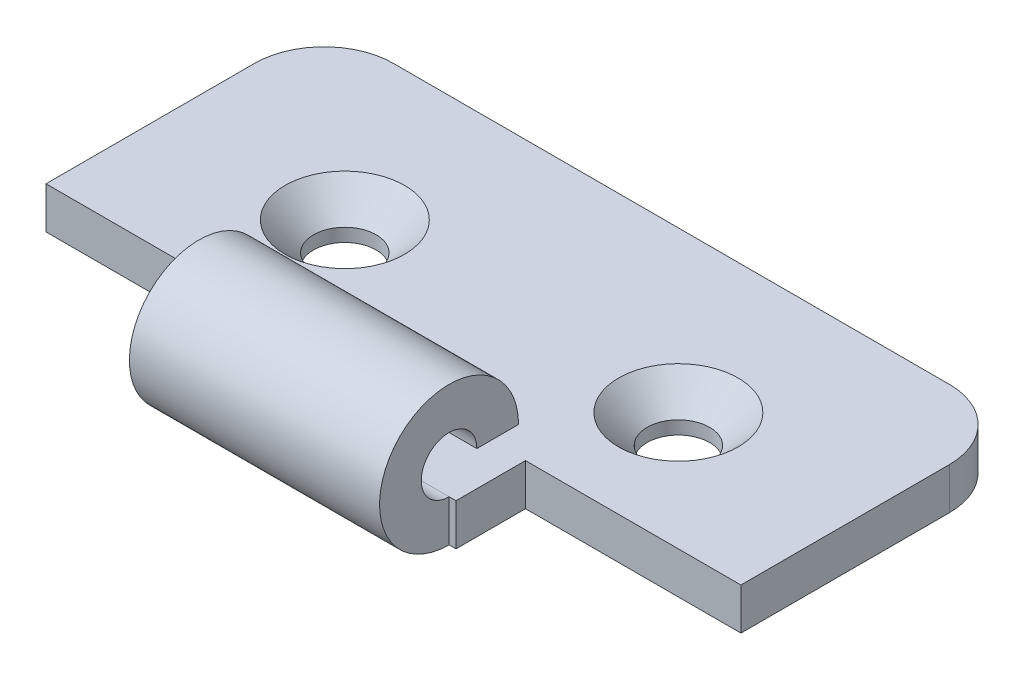
ISO-10303-21;
HEADER;
FILE_DESCRIPTION(('STEP AP214'),'2;1');
FILE_NAME('part.step','',(''),(''),'','','');
FILE_SCHEMA(('AUTOMOTIVE_DESIGN { 1 0 10303 214 1 1 1 1 }'));
ENDSEC;
DATA;
#1=APPLICATION_CONTEXT('core data for automotive mechanical design processes');
#2=APPLICATION_PROTOCOL_DEFINITION('international standard','automotive_design',2000,#1);
#3=PRODUCT_CONTEXT('',#1,'mechanical');
#4=PRODUCT('Part','Part','',(#3));
#5=PRODUCT_RELATED_PRODUCT_CATEGORY('part','',(#4));
#6=PRODUCT_DEFINITION_FORMATION('','',#4);
#7=PRODUCT_DEFINITION_CONTEXT('part definition',#1,'design');
#8=PRODUCT_DEFINITION('design','',#6,#7);
#9=PRODUCT_DEFINITION_SHAPE('','',#8);
#10=(LENGTH_UNIT() NAMED_UNIT(*) SI_UNIT(.MILLI.,.METRE.));
#11=(NAMED_UNIT(*) PLANE_ANGLE_UNIT() SI_UNIT($,.RADIAN.));
#12=(NAMED_UNIT(*) SI_UNIT($,.STERADIAN.) SOLID_ANGLE_UNIT());
#13=UNCERTAINTY_MEASURE_WITH_UNIT(LENGTH_MEASURE(1.E-05),#10,'distance_accuracy_value','');
#14=(GEOMETRIC_REPRESENTATION_CONTEXT(3) GLOBAL_UNCERTAINTY_ASSIGNED_CONTEXT((#13)) GLOBAL_UNIT_ASSIGNED_CONTEXT((#10,
#11,#12)) REPRESENTATION_CONTEXT('',''));
#15=CARTESIAN_POINT('',(0.,0.,0.));
#16=DIRECTION('',(0.,0.,1.));
#17=DIRECTION('',(1.,0.,0.));
#18=AXIS2_PLACEMENT_3D('',#15,#16,#17);
#19=CARTESIAN_POINT('',(20.,0.,-6.50000000000001));
#20=DIRECTION('',(0.,-1.,0.));
#21=DIRECTION('',(0.,0.,-1.));
#22=AXIS2_PLACEMENT_3D('',#19,#20,#21);
#23=PLANE('',#22);
#24=CARTESIAN_POINT('',(-12.,0.,0.));
#25=DIRECTION('',(0.,1.,0.));
#26=DIRECTION('',(0.,0.,1.));
#27=AXIS2_PLACEMENT_3D('',#24,#25,#26);
#28=CIRCLE('',#27,4.3);
#29=CARTESIAN_POINT('',(-12.,0.,4.3));
#30=VERTEX_POINT('',#29);
#31=EDGE_CURVE('E271',#30,#30,#28,.T.);
#32=ORIENTED_EDGE('',*,*,#31,.F.);
#33=EDGE_LOOP('',(#32));
#34=FACE_BOUND('',#33,.T.);
#35=CARTESIAN_POINT('',(20.,0.,-6.50000000000001));
#36=DIRECTION('',(0.,1.,0.));
#37=DIRECTION('',(0.,0.,-1.));
#38=AXIS2_PLACEMENT_3D('',#35,#36,#37);
#39=CIRCLE('',#38,4.99999999999999);
#40=CARTESIAN_POINT('',(25.,0.,-6.50000000000002));
#41=VERTEX_POINT('',#40);
#42=CARTESIAN_POINT('',(20.,0.,-11.5));
#43=VERTEX_POINT('',#42);
#44=EDGE_CURVE('E163',#41,#43,#39,.T.);
#45=ORIENTED_EDGE('',*,*,#44,.T.);
#46=DIRECTION('',(-1.,0.,0.));
#47=VECTOR('',#46,1.);
#48=CARTESIAN_POINT('',(-20.,0.,-11.5));
#49=LINE('',#48,#47);
#50=CARTESIAN_POINT('',(-20.,0.,-11.5));
#51=VERTEX_POINT('',#50);
#52=EDGE_CURVE('E166',#43,#51,#49,.T.);
#53=ORIENTED_EDGE('',*,*,#52,.T.);
#54=CARTESIAN_POINT('',(-20.,0.,-6.50000000000001));
#55=DIRECTION('',(0.,1.,0.));
#56=DIRECTION('',(0.,0.,-1.));
#57=AXIS2_PLACEMENT_3D('',#54,#55,#56);
#58=CIRCLE('',#57,4.99999999999999);
#59=CARTESIAN_POINT('',(-25.,0.,-6.50000000000001));
#60=VERTEX_POINT('',#59);
#61=EDGE_CURVE('E170',#51,#60,#58,.T.);
#62=ORIENTED_EDGE('',*,*,#61,.T.);
#63=DIRECTION('',(0.,0.,1.));
#64=VECTOR('',#63,1.);
#65=CARTESIAN_POINT('',(-25.,0.,8.5));
#66=LINE('',#65,#64);
#67=CARTESIAN_POINT('',(-25.,0.,8.5));
#68=VERTEX_POINT('',#67);
#69=EDGE_CURVE('E173',#60,#68,#66,.T.);
#70=ORIENTED_EDGE('',*,*,#69,.T.);
#71=DIRECTION('',(1.,0.,0.));
#72=VECTOR('',#71,1.);
#73=CARTESIAN_POINT('',(-25.,0.,8.5));
#74=LINE('',#73,#72);
#75=CARTESIAN_POINT('',(-9.5,0.,8.5));
#76=VERTEX_POINT('',#75);
#77=EDGE_CURVE('E176',#68,#76,#74,.T.);
#78=ORIENTED_EDGE('',*,*,#77,.T.);
#79=DIRECTION('',(0.,0.,1.));
#80=VECTOR('',#79,1.);
#81=CARTESIAN_POINT('',(-9.5,0.,13.5));
#82=LINE('',#81,#80);
#83=CARTESIAN_POINT('',(-9.5,0.,13.5));
#84=VERTEX_POINT('',#83);
#85=EDGE_CURVE('E179',#76,#84,#82,.T.);
#86=ORIENTED_EDGE('',*,*,#85,.T.);
#87=DIRECTION('',(1.,0.,0.));
#88=VECTOR('',#87,1.);
#89=CARTESIAN_POINT('',(-9.5,0.,13.5));
#90=LINE('',#89,#88);
#91=CARTESIAN_POINT('',(-9.,0.,13.5));
#92=VERTEX_POINT('',#91);
#93=EDGE_CURVE('E183',#84,#92,#90,.T.);
#94=ORIENTED_EDGE('',*,*,#93,.T.);
#95=DIRECTION('',(1.,0.,0.));
#96=VECTOR('',#95,1.);
#97=CARTESIAN_POINT('',(9.,0.,13.5));
#98=LINE('',#97,#96);
#99=CARTESIAN_POINT('',(9.,0.,13.5));
#100=VERTEX_POINT('',#99);
#101=EDGE_CURVE('E302',#100,#92,#98,.F.);
#102=ORIENTED_EDGE('',*,*,#101,.F.);
#103=CARTESIAN_POINT('',(9.50000000000001,0.,13.5));
#104=VERTEX_POINT('',#103);
#105=EDGE_CURVE('E182',#100,#104,#90,.T.);
#106=ORIENTED_EDGE('',*,*,#105,.T.);
#107=DIRECTION('',(0.,0.,-1.));
#108=VECTOR('',#107,1.);
#109=CARTESIAN_POINT('',(9.50000000000001,0.,13.5));
#110=LINE('',#109,#108);
#111=CARTESIAN_POINT('',(9.5,0.,8.5));
#112=VERTEX_POINT('',#111);
#113=EDGE_CURVE('E186',#104,#112,#110,.T.);
#114=ORIENTED_EDGE('',*,*,#113,.T.);
#115=DIRECTION('',(1.,0.,0.));
#116=VECTOR('',#115,1.);
#117=CARTESIAN_POINT('',(25.,0.,8.5));
#118=LINE('',#117,#116);
#119=CARTESIAN_POINT('',(25.,0.,8.5));
#120=VERTEX_POINT('',#119);
#121=EDGE_CURVE('E138',#112,#120,#118,.T.);
#122=ORIENTED_EDGE('',*,*,#121,.T.);
#123=DIRECTION('',(0.,0.,-1.));
#124=VECTOR('',#123,1.);
#125=CARTESIAN_POINT('',(25.,0.,8.5));
#126=LINE('',#125,#124);
#127=EDGE_CURVE('E189',#120,#41,#126,.T.);
#128=ORIENTED_EDGE('',*,*,#127,.T.);
#129=EDGE_LOOP('',(#45,#53,#62,#70,#78,#86,#94,#102,#106,#114,#122,#128));
#130=FACE_BOUND('',#129,.T.);
#131=CARTESIAN_POINT('',(12.,0.,0.));
#132=DIRECTION('',(0.,1.,0.));
#133=DIRECTION('',(0.,0.,1.));
#134=AXIS2_PLACEMENT_3D('',#131,#132,#133);
#135=CIRCLE('',#134,4.3);
#136=CARTESIAN_POINT('',(12.,0.,4.3));
#137=VERTEX_POINT('',#136);
#138=EDGE_CURVE('E278',#137,#137,#135,.T.);
#139=ORIENTED_EDGE('',*,*,#138,.F.);
#140=EDGE_LOOP('',(#139));
#141=FACE_BOUND('',#140,.T.);
#142=ADVANCED_FACE('F38',(#34,#130,#141),#23,.F.);
#143=CARTESIAN_POINT('',(-9.5,-3.,13.5));
#144=DIRECTION('',(0.,0.,1.));
#145=DIRECTION('',(1.,0.,0.));
#146=AXIS2_PLACEMENT_3D('',#143,#144,#145);
#147=PLANE('',#146);
#148=ORIENTED_EDGE('',*,*,#105,.F.);
#149=DIRECTION('',(0.,-1.,0.));
#150=VECTOR('',#149,1.);
#151=CARTESIAN_POINT('',(9.,0.,13.5));
#152=LINE('',#151,#150);
#153=CARTESIAN_POINT('',(9.,-3.,13.5));
#154=VERTEX_POINT('',#153);
#155=EDGE_CURVE('E294',#100,#154,#152,.T.);
#156=ORIENTED_EDGE('',*,*,#155,.T.);
#157=DIRECTION('',(1.,0.,0.));
#158=VECTOR('',#157,1.);
#159=CARTESIAN_POINT('',(-9.5,-3.,13.5));
#160=LINE('',#159,#158);
#161=CARTESIAN_POINT('',(9.50000000000001,-3.,13.5));
#162=VERTEX_POINT('',#161);
#163=EDGE_CURVE('E158',#154,#162,#160,.T.);
#164=ORIENTED_EDGE('',*,*,#163,.T.);
#165=DIRECTION('',(0.,1.,0.));
#166=VECTOR('',#165,1.);
#167=CARTESIAN_POINT('',(9.50000000000001,-3.,13.5));
#168=LINE('',#167,#166);
#169=EDGE_CURVE('E143',#162,#104,#168,.T.);
#170=ORIENTED_EDGE('',*,*,#169,.T.);
#171=EDGE_LOOP('',(#148,#156,#164,#170));
#172=FACE_BOUND('',#171,.T.);
#173=ADVANCED_FACE('F215',(#172),#147,.T.);
#174=CARTESIAN_POINT('',(20.,-3.,-6.50000000000001));
#175=DIRECTION('',(0.,1.,0.));
#176=DIRECTION('',(0.,0.,1.));
#177=AXIS2_PLACEMENT_3D('',#174,#175,#176);
#178=CYLINDRICAL_SURFACE('',#177,4.99999999999999);
#179=ORIENTED_EDGE('',*,*,#44,.F.);
#180=DIRECTION('',(0.,1.,0.));
#181=VECTOR('',#180,1.);
#182=CARTESIAN_POINT('',(25.,-3.,-6.50000000000002));
#183=LINE('',#182,#181);
#184=CARTESIAN_POINT('',(25.,-3.,-6.50000000000002));
#185=VERTEX_POINT('',#184);
#186=EDGE_CURVE('E11',#185,#41,#183,.T.);
#187=ORIENTED_EDGE('',*,*,#186,.F.);
#188=CARTESIAN_POINT('',(20.,-3.,-6.50000000000001));
#189=DIRECTION('',(0.,1.,0.));
#190=DIRECTION('',(0.,0.,-1.));
#191=AXIS2_PLACEMENT_3D('',#188,#189,#190);
#192=CIRCLE('',#191,4.99999999999999);
#193=CARTESIAN_POINT('',(20.,-3.,-11.5));
#194=VERTEX_POINT('',#193);
#195=EDGE_CURVE('E191',#185,#194,#192,.T.);
#196=ORIENTED_EDGE('',*,*,#195,.T.);
#197=DIRECTION('',(0.,1.,0.));
#198=VECTOR('',#197,1.);
#199=CARTESIAN_POINT('',(20.,-3.,-11.5));
#200=LINE('',#199,#198);
#201=EDGE_CURVE('E42',#194,#43,#200,.T.);
#202=ORIENTED_EDGE('',*,*,#201,.T.);
#203=EDGE_LOOP('',(#179,#187,#196,#202));
#204=FACE_BOUND('',#203,.T.);
#205=ADVANCED_FACE('F40',(#204),#178,.T.);
#206=CARTESIAN_POINT('',(25.,-3.,8.5));
#207=DIRECTION('',(1.,0.,0.));
#208=DIRECTION('',(0.,0.,-1.));
#209=AXIS2_PLACEMENT_3D('',#206,#207,#208);
#210=PLANE('',#209);
#211=ORIENTED_EDGE('',*,*,#127,.F.);
#212=DIRECTION('',(0.,1.,0.));
#213=VECTOR('',#212,1.);
#214=CARTESIAN_POINT('',(25.,-3.,8.5));
#215=LINE('',#214,#213);
#216=CARTESIAN_POINT('',(25.,-3.,8.5));
#217=VERTEX_POINT('',#216);
#218=EDGE_CURVE('E47',#217,#120,#215,.T.);
#219=ORIENTED_EDGE('',*,*,#218,.F.);
#220=DIRECTION('',(0.,0.,-1.));
#221=VECTOR('',#220,1.);
#222=CARTESIAN_POINT('',(25.,-3.,8.5));
#223=LINE('',#222,#221);
#224=EDGE_CURVE('E150',#217,#185,#223,.T.);
#225=ORIENTED_EDGE('',*,*,#224,.T.);
#226=ORIENTED_EDGE('',*,*,#186,.T.);
#227=EDGE_LOOP('',(#211,#219,#225,#226));
#228=FACE_BOUND('',#227,.T.);
#229=ADVANCED_FACE('F207',(#228),#210,.T.);
#230=CARTESIAN_POINT('',(25.,-3.,8.5));
#231=DIRECTION('',(0.,0.,1.));
#232=DIRECTION('',(1.,0.,0.));
#233=AXIS2_PLACEMENT_3D('',#230,#231,#232);
#234=PLANE('',#233);
#235=ORIENTED_EDGE('',*,*,#121,.F.);
#236=DIRECTION('',(0.,1.,0.));
#237=VECTOR('',#236,1.);
#238=CARTESIAN_POINT('',(9.5,-3.,8.5));
#239=LINE('',#238,#237);
#240=CARTESIAN_POINT('',(9.5,-3.,8.5));
#241=VERTEX_POINT('',#240);
#242=EDGE_CURVE('E132',#241,#112,#239,.T.);
#243=ORIENTED_EDGE('',*,*,#242,.F.);
#244=DIRECTION('',(1.,0.,0.));
#245=VECTOR('',#244,1.);
#246=CARTESIAN_POINT('',(25.,-3.,8.5));
#247=LINE('',#246,#245);
#248=EDGE_CURVE('E135',#241,#217,#247,.T.);
#249=ORIENTED_EDGE('',*,*,#248,.T.);
#250=ORIENTED_EDGE('',*,*,#218,.T.);
#251=EDGE_LOOP('',(#235,#243,#249,#250));
#252=FACE_BOUND('',#251,.T.);
#253=ADVANCED_FACE('F134',(#252),#234,.T.);
#254=CARTESIAN_POINT('',(9.50000000000001,-3.,13.5));
#255=DIRECTION('',(1.,0.,0.));
#256=DIRECTION('',(0.,0.,-1.));
#257=AXIS2_PLACEMENT_3D('',#254,#255,#256);
#258=PLANE('',#257);
#259=ORIENTED_EDGE('',*,*,#113,.F.);
#260=ORIENTED_EDGE('',*,*,#169,.F.);
#261=DIRECTION('',(0.,0.,-1.));
#262=VECTOR('',#261,1.);
#263=CARTESIAN_POINT('',(9.50000000000001,-3.,13.5));
#264=LINE('',#263,#262);
#265=EDGE_CURVE('E149',#162,#241,#264,.T.);
#266=ORIENTED_EDGE('',*,*,#265,.T.);
#267=ORIENTED_EDGE('',*,*,#242,.T.);
#268=EDGE_LOOP('',(#259,#260,#266,#267));
#269=FACE_BOUND('',#268,.T.);
#270=ADVANCED_FACE('F153',(#269),#258,.T.);
#271=DIRECTION('',(0.,-1.,0.));
#272=VECTOR('',#271,1.);
#273=CARTESIAN_POINT('',(-9.,0.,13.5));
#274=LINE('',#273,#272);
#275=CARTESIAN_POINT('',(-9.,-3.,13.5));
#276=VERTEX_POINT('',#275);
#277=EDGE_CURVE('E310',#92,#276,#274,.T.);
#278=ORIENTED_EDGE('',*,*,#277,.F.);
#279=ORIENTED_EDGE('',*,*,#93,.F.);
#280=DIRECTION('',(0.,1.,0.));
#281=VECTOR('',#280,1.);
#282=CARTESIAN_POINT('',(-9.5,-3.,13.5));
#283=LINE('',#282,#281);
#284=CARTESIAN_POINT('',(-9.5,-3.,13.5));
#285=VERTEX_POINT('',#284);
#286=EDGE_CURVE('E195',#285,#84,#283,.T.);
#287=ORIENTED_EDGE('',*,*,#286,.F.);
#288=EDGE_CURVE('E155',#285,#276,#160,.T.);
#289=ORIENTED_EDGE('',*,*,#288,.T.);
#290=EDGE_LOOP('',(#278,#279,#287,#289));
#291=FACE_BOUND('',#290,.T.);
#292=ADVANCED_FACE('F224',(#291),#147,.T.);
#293=CARTESIAN_POINT('',(-9.5,-3.,13.5));
#294=DIRECTION('',(-1.,0.,0.));
#295=DIRECTION('',(0.,0.,1.));
#296=AXIS2_PLACEMENT_3D('',#293,#294,#295);
#297=PLANE('',#296);
#298=ORIENTED_EDGE('',*,*,#85,.F.);
#299=DIRECTION('',(0.,1.,0.));
#300=VECTOR('',#299,1.);
#301=CARTESIAN_POINT('',(-9.5,-3.,8.5));
#302=LINE('',#301,#300);
#303=CARTESIAN_POINT('',(-9.5,-3.,8.5));
#304=VERTEX_POINT('',#303);
#305=EDGE_CURVE('E197',#304,#76,#302,.T.);
#306=ORIENTED_EDGE('',*,*,#305,.F.);
#307=DIRECTION('',(0.,0.,1.));
#308=VECTOR('',#307,1.);
#309=CARTESIAN_POINT('',(-9.5,-3.,13.5));
#310=LINE('',#309,#308);
#311=EDGE_CURVE('E330',#304,#285,#310,.T.);
#312=ORIENTED_EDGE('',*,*,#311,.T.);
#313=ORIENTED_EDGE('',*,*,#286,.T.);
#314=EDGE_LOOP('',(#298,#306,#312,#313));
#315=FACE_BOUND('',#314,.T.);
#316=ADVANCED_FACE('F344',(#315),#297,.T.);
#317=CARTESIAN_POINT('',(-25.,-3.,8.5));
#318=DIRECTION('',(0.,0.,1.));
#319=DIRECTION('',(1.,0.,0.));
#320=AXIS2_PLACEMENT_3D('',#317,#318,#319);
#321=PLANE('',#320);
#322=ORIENTED_EDGE('',*,*,#77,.F.);
#323=DIRECTION('',(0.,1.,0.));
#324=VECTOR('',#323,1.);
#325=CARTESIAN_POINT('',(-25.,-3.,8.5));
#326=LINE('',#325,#324);
#327=CARTESIAN_POINT('',(-25.,-3.,8.5));
#328=VERTEX_POINT('',#327);
#329=EDGE_CURVE('E199',#328,#68,#326,.T.);
#330=ORIENTED_EDGE('',*,*,#329,.F.);
#331=DIRECTION('',(1.,0.,0.));
#332=VECTOR('',#331,1.);
#333=CARTESIAN_POINT('',(-25.,-3.,8.5));
#334=LINE('',#333,#332);
#335=EDGE_CURVE('E328',#328,#304,#334,.T.);
#336=ORIENTED_EDGE('',*,*,#335,.T.);
#337=ORIENTED_EDGE('',*,*,#305,.T.);
#338=EDGE_LOOP('',(#322,#330,#336,#337));
#339=FACE_BOUND('',#338,.T.);
#340=ADVANCED_FACE('F348',(#339),#321,.T.);
#341=CARTESIAN_POINT('',(-25.,-3.,8.5));
#342=DIRECTION('',(-1.,0.,0.));
#343=DIRECTION('',(0.,0.,1.));
#344=AXIS2_PLACEMENT_3D('',#341,#342,#343);
#345=PLANE('',#344);
#346=ORIENTED_EDGE('',*,*,#69,.F.);
#347=DIRECTION('',(0.,1.,0.));
#348=VECTOR('',#347,1.);
#349=CARTESIAN_POINT('',(-25.,-3.,-6.50000000000001));
#350=LINE('',#349,#348);
#351=CARTESIAN_POINT('',(-25.,-3.,-6.50000000000001));
#352=VERTEX_POINT('',#351);
#353=EDGE_CURVE('E201',#352,#60,#350,.T.);
#354=ORIENTED_EDGE('',*,*,#353,.F.);
#355=DIRECTION('',(0.,0.,1.));
#356=VECTOR('',#355,1.);
#357=CARTESIAN_POINT('',(-25.,-3.,8.5));
#358=LINE('',#357,#356);
#359=EDGE_CURVE('E325',#352,#328,#358,.T.);
#360=ORIENTED_EDGE('',*,*,#359,.T.);
#361=ORIENTED_EDGE('',*,*,#329,.T.);
#362=EDGE_LOOP('',(#346,#354,#360,#361));
#363=FACE_BOUND('',#362,.T.);
#364=ADVANCED_FACE('F353',(#363),#345,.T.);
#365=CARTESIAN_POINT('',(-20.,-3.,-6.50000000000001));
#366=DIRECTION('',(0.,1.,0.));
#367=DIRECTION('',(0.,0.,1.));
#368=AXIS2_PLACEMENT_3D('',#365,#366,#367);
#369=CYLINDRICAL_SURFACE('',#368,4.99999999999999);
#370=ORIENTED_EDGE('',*,*,#61,.F.);
#371=DIRECTION('',(0.,1.,0.));
#372=VECTOR('',#371,1.);
#373=CARTESIAN_POINT('',(-20.,-3.,-11.5));
#374=LINE('',#373,#372);
#375=CARTESIAN_POINT('',(-20.,-3.,-11.5));
#376=VERTEX_POINT('',#375);
#377=EDGE_CURVE('E202',#376,#51,#374,.T.);
#378=ORIENTED_EDGE('',*,*,#377,.F.);
#379=CARTESIAN_POINT('',(-20.,-3.,-6.50000000000001));
#380=DIRECTION('',(0.,1.,0.));
#381=DIRECTION('',(0.,0.,-1.));
#382=AXIS2_PLACEMENT_3D('',#379,#380,#381);
#383=CIRCLE('',#382,4.99999999999999);
#384=EDGE_CURVE('E322',#376,#352,#383,.T.);
#385=ORIENTED_EDGE('',*,*,#384,.T.);
#386=ORIENTED_EDGE('',*,*,#353,.T.);
#387=EDGE_LOOP('',(#370,#378,#385,#386));
#388=FACE_BOUND('',#387,.T.);
#389=ADVANCED_FACE('F355',(#388),#369,.T.);
#390=CARTESIAN_POINT('',(-20.,-3.,-11.5));
#391=DIRECTION('',(0.,0.,-1.));
#392=DIRECTION('',(-1.,0.,0.));
#393=AXIS2_PLACEMENT_3D('',#390,#391,#392);
#394=PLANE('',#393);
#395=ORIENTED_EDGE('',*,*,#52,.F.);
#396=ORIENTED_EDGE('',*,*,#201,.F.);
#397=DIRECTION('',(-1.,0.,0.));
#398=VECTOR('',#397,1.);
#399=CARTESIAN_POINT('',(-20.,-3.,-11.5));
#400=LINE('',#399,#398);
#401=EDGE_CURVE('E320',#194,#376,#400,.T.);
#402=ORIENTED_EDGE('',*,*,#401,.T.);
#403=ORIENTED_EDGE('',*,*,#377,.T.);
#404=EDGE_LOOP('',(#395,#396,#402,#403));
#405=FACE_BOUND('',#404,.T.);
#406=ADVANCED_FACE('F204',(#405),#394,.T.);
#407=CARTESIAN_POINT('',(20.,-3.,-6.50000000000001));
#408=DIRECTION('',(0.,-1.,0.));
#409=DIRECTION('',(0.,0.,-1.));
#410=AXIS2_PLACEMENT_3D('',#407,#408,#409);
#411=PLANE('',#410);
#412=CARTESIAN_POINT('',(-12.,-3.,0.));
#413=DIRECTION('',(0.,1.,0.));
#414=DIRECTION('',(0.,0.,1.));
#415=AXIS2_PLACEMENT_3D('',#412,#413,#414);
#416=CIRCLE('',#415,2.25);
#417=CARTESIAN_POINT('',(-12.,-3.,2.25));
#418=VERTEX_POINT('',#417);
#419=EDGE_CURVE('E273',#418,#418,#416,.T.);
#420=ORIENTED_EDGE('',*,*,#419,.T.);
#421=EDGE_LOOP('',(#420));
#422=FACE_BOUND('',#421,.T.);
#423=CARTESIAN_POINT('',(12.,-3.,0.));
#424=DIRECTION('',(0.,1.,0.));
#425=DIRECTION('',(0.,0.,1.));
#426=AXIS2_PLACEMENT_3D('',#423,#424,#425);
#427=CIRCLE('',#426,2.25);
#428=CARTESIAN_POINT('',(12.,-3.,2.25));
#429=VERTEX_POINT('',#428);
#430=EDGE_CURVE('E284',#429,#429,#427,.T.);
#431=ORIENTED_EDGE('',*,*,#430,.T.);
#432=EDGE_LOOP('',(#431));
#433=FACE_BOUND('',#432,.T.);
#434=ORIENTED_EDGE('',*,*,#195,.F.);
#435=ORIENTED_EDGE('',*,*,#224,.F.);
#436=ORIENTED_EDGE('',*,*,#248,.F.);
#437=ORIENTED_EDGE('',*,*,#265,.F.);
#438=ORIENTED_EDGE('',*,*,#163,.F.);
#439=DIRECTION('',(1.,0.,0.));
#440=VECTOR('',#439,1.);
#441=CARTESIAN_POINT('',(9.,-3.,13.5));
#442=LINE('',#441,#440);
#443=EDGE_CURVE('E288',#154,#276,#442,.F.);
#444=ORIENTED_EDGE('',*,*,#443,.T.);
#445=ORIENTED_EDGE('',*,*,#288,.F.);
#446=ORIENTED_EDGE('',*,*,#311,.F.);
#447=ORIENTED_EDGE('',*,*,#335,.F.);
#448=ORIENTED_EDGE('',*,*,#359,.F.);
#449=ORIENTED_EDGE('',*,*,#384,.F.);
#450=ORIENTED_EDGE('',*,*,#401,.F.);
#451=EDGE_LOOP('',(#434,#435,#436,#437,#438,#444,#445,#446,#447,#448,#449,#450));
#452=FACE_BOUND('',#451,.T.);
#453=ADVANCED_FACE('F147',(#422,#433,#452),#411,.T.);
#454=CARTESIAN_POINT('',(0.,1.99999999999998,11.5));
#455=DIRECTION('',(0.,1.,0.));
#456=DIRECTION('',(1.,0.,0.));
#457=AXIS2_PLACEMENT_3D('',#454,#455,#456);
#458=PLANE('',#457);
#459=DIRECTION('',(0.,0.,-1.));
#460=VECTOR('',#459,1.);
#461=CARTESIAN_POINT('',(9.,1.99999999999998,11.5));
#462=LINE('',#461,#460);
#463=CARTESIAN_POINT('',(9.,1.99999999999998,11.5));
#464=VERTEX_POINT('',#463);
#465=CARTESIAN_POINT('',(9.,1.99999999999995,8.5));
#466=VERTEX_POINT('',#465);
#467=EDGE_CURVE('E167',#464,#466,#462,.T.);
#468=ORIENTED_EDGE('',*,*,#467,.F.);
#469=DIRECTION('',(1.,0.,0.));
#470=VECTOR('',#469,1.);
#471=CARTESIAN_POINT('',(9.,1.99999999999998,11.5));
#472=LINE('',#471,#470);
#473=CARTESIAN_POINT('',(-9.,1.99999999999998,11.5));
#474=VERTEX_POINT('',#473);
#475=EDGE_CURVE('E287',#474,#464,#472,.T.);
#476=ORIENTED_EDGE('',*,*,#475,.F.);
#477=DIRECTION('',(0.,0.,-1.));
#478=VECTOR('',#477,1.);
#479=CARTESIAN_POINT('',(-9.,1.99999999999998,11.5));
#480=LINE('',#479,#478);
#481=CARTESIAN_POINT('',(-9.,1.99999999999995,8.5));
#482=VERTEX_POINT('',#481);
#483=EDGE_CURVE('E313',#474,#482,#480,.T.);
#484=ORIENTED_EDGE('',*,*,#483,.T.);
#485=DIRECTION('',(1.,0.,0.));
#486=VECTOR('',#485,1.);
#487=CARTESIAN_POINT('',(9.,1.99999999999995,8.5));
#488=LINE('',#487,#486);
#489=EDGE_CURVE('E295',#482,#466,#488,.T.);
#490=ORIENTED_EDGE('',*,*,#489,.T.);
#491=EDGE_LOOP('',(#468,#476,#484,#490));
#492=FACE_BOUND('',#491,.T.);
#493=ADVANCED_FACE('F229',(#492),#458,.F.);
#494=CARTESIAN_POINT('',(-9.,2.,13.5));
#495=DIRECTION('',(-1.,0.,0.));
#496=DIRECTION('',(0.,0.,1.));
#497=AXIS2_PLACEMENT_3D('',#494,#495,#496);
#498=PLANE('',#497);
#499=ORIENTED_EDGE('',*,*,#483,.F.);
#500=CARTESIAN_POINT('',(-9.,2.,13.5));
#501=DIRECTION('',(1.,0.,0.));
#502=DIRECTION('',(0.,0.,-1.));
#503=AXIS2_PLACEMENT_3D('',#500,#501,#502);
#504=CIRCLE('',#503,2.);
#505=EDGE_CURVE('E298',#92,#474,#504,.F.);
#506=ORIENTED_EDGE('',*,*,#505,.F.);
#507=ORIENTED_EDGE('',*,*,#277,.T.);
#508=CARTESIAN_POINT('',(-9.,2.,13.5));
#509=DIRECTION('',(1.,0.,0.));
#510=DIRECTION('',(0.,0.,-1.));
#511=AXIS2_PLACEMENT_3D('',#508,#509,#510);
#512=CIRCLE('',#511,5.);
#513=EDGE_CURVE('E291',#276,#482,#512,.F.);
#514=ORIENTED_EDGE('',*,*,#513,.T.);
#515=EDGE_LOOP('',(#499,#506,#507,#514));
#516=FACE_BOUND('',#515,.T.);
#517=ADVANCED_FACE('F235',(#516),#498,.T.);
#518=CARTESIAN_POINT('',(9.,2.,13.5));
#519=DIRECTION('',(-1.,0.,0.));
#520=DIRECTION('',(0.,0.,1.));
#521=AXIS2_PLACEMENT_3D('',#518,#519,#520);
#522=PLANE('',#521);
#523=CARTESIAN_POINT('',(9.,2.,13.5));
#524=DIRECTION('',(1.,0.,0.));
#525=DIRECTION('',(0.,0.,-1.));
#526=AXIS2_PLACEMENT_3D('',#523,#524,#525);
#527=CIRCLE('',#526,2.);
#528=EDGE_CURVE('E305',#464,#100,#527,.T.);
#529=ORIENTED_EDGE('',*,*,#528,.F.);
#530=ORIENTED_EDGE('',*,*,#467,.T.);
#531=CARTESIAN_POINT('',(9.,2.,13.5));
#532=DIRECTION('',(1.,0.,0.));
#533=DIRECTION('',(0.,0.,-1.));
#534=AXIS2_PLACEMENT_3D('',#531,#532,#533);
#535=CIRCLE('',#534,5.);
#536=EDGE_CURVE('E55',#466,#154,#535,.T.);
#537=ORIENTED_EDGE('',*,*,#536,.T.);
#538=ORIENTED_EDGE('',*,*,#155,.F.);
#539=EDGE_LOOP('',(#529,#530,#537,#538));
#540=FACE_BOUND('',#539,.T.);
#541=ADVANCED_FACE('F231',(#540),#522,.F.);
#542=CARTESIAN_POINT('',(9.,2.,13.5));
#543=DIRECTION('',(1.,0.,0.));
#544=DIRECTION('',(0.,0.,-1.));
#545=AXIS2_PLACEMENT_3D('',#542,#543,#544);
#546=CYLINDRICAL_SURFACE('',#545,5.);
#547=ORIENTED_EDGE('',*,*,#443,.F.);
#548=ORIENTED_EDGE('',*,*,#536,.F.);
#549=ORIENTED_EDGE('',*,*,#489,.F.);
#550=ORIENTED_EDGE('',*,*,#513,.F.);
#551=EDGE_LOOP('',(#547,#548,#549,#550));
#552=FACE_BOUND('',#551,.T.);
#553=ADVANCED_FACE('F234',(#552),#546,.T.);
#554=CARTESIAN_POINT('',(9.,2.,13.5));
#555=DIRECTION('',(1.,0.,0.));
#556=DIRECTION('',(0.,0.,-1.));
#557=AXIS2_PLACEMENT_3D('',#554,#555,#556);
#558=CYLINDRICAL_SURFACE('',#557,2.);
#559=ORIENTED_EDGE('',*,*,#101,.T.);
#560=ORIENTED_EDGE('',*,*,#505,.T.);
#561=ORIENTED_EDGE('',*,*,#475,.T.);
#562=ORIENTED_EDGE('',*,*,#528,.T.);
#563=EDGE_LOOP('',(#559,#560,#561,#562));
#564=FACE_BOUND('',#563,.T.);
#565=ADVANCED_FACE('F242',(#564),#558,.F.);
#566=CARTESIAN_POINT('',(12.,0.,0.));
#567=DIRECTION('',(0.,1.,0.));
#568=DIRECTION('',(0.,0.,1.));
#569=AXIS2_PLACEMENT_3D('',#566,#567,#568);
#570=CYLINDRICAL_SURFACE('',#569,2.24999999999999);
#571=ORIENTED_EDGE('',*,*,#430,.F.);
#572=EDGE_LOOP('',(#571));
#573=FACE_BOUND('',#572,.T.);
#574=CARTESIAN_POINT('',(12.,-2.05,0.));
#575=DIRECTION('',(0.,1.,0.));
#576=DIRECTION('',(0.,0.,1.));
#577=AXIS2_PLACEMENT_3D('',#574,#575,#576);
#578=CIRCLE('',#577,2.24999999999999);
#579=CARTESIAN_POINT('',(12.,-2.05,2.24999999999999));
#580=VERTEX_POINT('',#579);
#581=EDGE_CURVE('E281',#580,#580,#578,.T.);
#582=ORIENTED_EDGE('',*,*,#581,.T.);
#583=EDGE_LOOP('',(#582));
#584=FACE_BOUND('',#583,.T.);
#585=ADVANCED_FACE('F245',(#573,#584),#570,.F.);
#586=CARTESIAN_POINT('',(12.,0.,0.));
#587=DIRECTION('',(0.,1.,0.));
#588=DIRECTION('',(0.,0.,1.));
#589=AXIS2_PLACEMENT_3D('',#586,#587,#588);
#590=CONICAL_SURFACE('',#589,4.3,0.785398163397452);
#591=ORIENTED_EDGE('',*,*,#581,.F.);
#592=EDGE_LOOP('',(#591));
#593=FACE_BOUND('',#592,.T.);
#594=ORIENTED_EDGE('',*,*,#138,.T.);
#595=EDGE_LOOP('',(#594));
#596=FACE_BOUND('',#595,.T.);
#597=ADVANCED_FACE('F252',(#593,#596),#590,.F.);
#598=CARTESIAN_POINT('',(-12.,0.,0.));
#599=DIRECTION('',(0.,1.,0.));
#600=DIRECTION('',(0.,0.,1.));
#601=AXIS2_PLACEMENT_3D('',#598,#599,#600);
#602=CYLINDRICAL_SURFACE('',#601,2.24999999999999);
#603=ORIENTED_EDGE('',*,*,#419,.F.);
#604=EDGE_LOOP('',(#603));
#605=FACE_BOUND('',#604,.T.);
#606=CARTESIAN_POINT('',(-12.,-2.05,0.));
#607=DIRECTION('',(0.,1.,0.));
#608=DIRECTION('',(0.,0.,1.));
#609=AXIS2_PLACEMENT_3D('',#606,#607,#608);
#610=CIRCLE('',#609,2.24999999999999);
#611=CARTESIAN_POINT('',(-12.,-2.05,2.24999999999999));
#612=VERTEX_POINT('',#611);
#613=EDGE_CURVE('E269',#612,#612,#610,.T.);
#614=ORIENTED_EDGE('',*,*,#613,.T.);
#615=EDGE_LOOP('',(#614));
#616=FACE_BOUND('',#615,.T.);
#617=ADVANCED_FACE('F256',(#605,#616),#602,.F.);
#618=CARTESIAN_POINT('',(-12.,0.,0.));
#619=DIRECTION('',(0.,1.,0.));
#620=DIRECTION('',(0.,0.,1.));
#621=AXIS2_PLACEMENT_3D('',#618,#619,#620);
#622=CONICAL_SURFACE('',#621,4.3,0.785398163397452);
#623=ORIENTED_EDGE('',*,*,#613,.F.);
#624=EDGE_LOOP('',(#623));
#625=FACE_BOUND('',#624,.T.);
#626=ORIENTED_EDGE('',*,*,#31,.T.);
#627=EDGE_LOOP('',(#626));
#628=FACE_BOUND('',#627,.T.);
#629=ADVANCED_FACE('F260',(#625,#628),#622,.F.);
#630=CLOSED_SHELL('',(#142,#173,#205,#229,#253,#270,#292,#316,#340,#364,#389,#406,#453,#493,
#517,#541,#553,#565,#585,#597,#617,#629));
#631=MANIFOLD_SOLID_BREP('B2',#630);
#632=ADVANCED_BREP_SHAPE_REPRESENTATION('',(#18,#631),#14);
#633=SHAPE_DEFINITION_REPRESENTATION(#9,#632);
ENDSEC;
END-ISO-10303-21;
